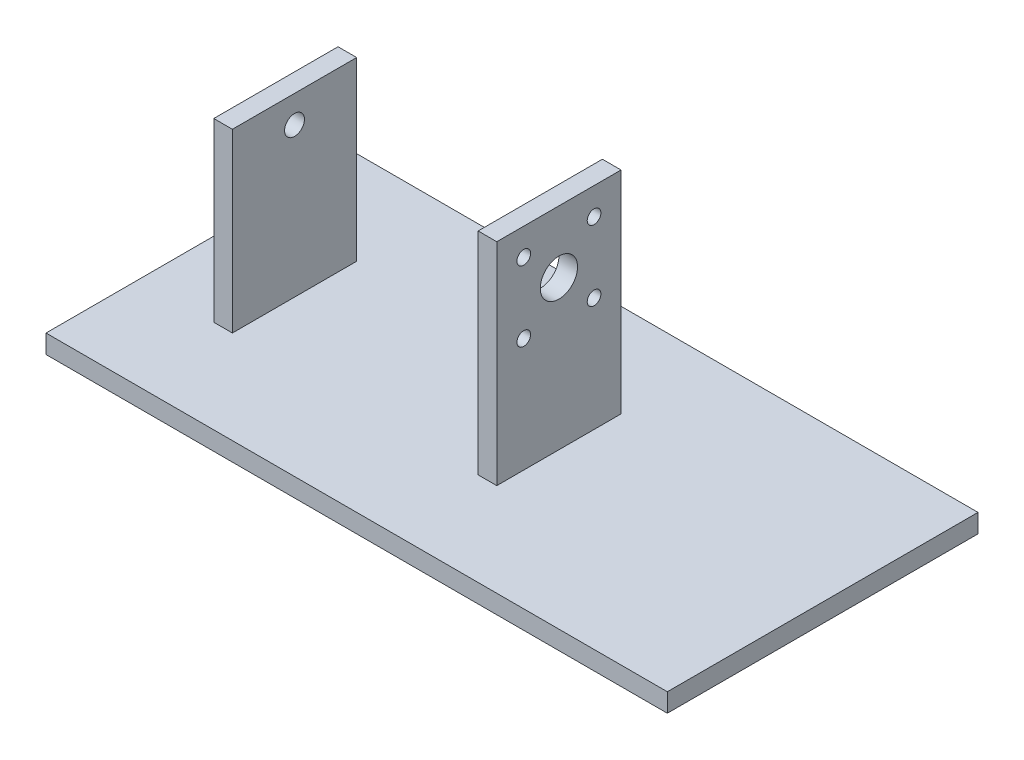
ISO-10303-21;
HEADER;
FILE_DESCRIPTION(('STEP AP214'),'2;1');
FILE_NAME('part.step','',(''),(''),'','','');
FILE_SCHEMA(('AUTOMOTIVE_DESIGN { 1 0 10303 214 1 1 1 1 }'));
ENDSEC;
DATA;
#1=APPLICATION_CONTEXT('core data for automotive mechanical design processes');
#2=APPLICATION_PROTOCOL_DEFINITION('international standard','automotive_design',2000,#1);
#3=PRODUCT_CONTEXT('',#1,'mechanical');
#4=PRODUCT('Part','Part','',(#3));
#5=PRODUCT_RELATED_PRODUCT_CATEGORY('part','',(#4));
#6=PRODUCT_DEFINITION_FORMATION('','',#4);
#7=PRODUCT_DEFINITION_CONTEXT('part definition',#1,'design');
#8=PRODUCT_DEFINITION('design','',#6,#7);
#9=PRODUCT_DEFINITION_SHAPE('','',#8);
#10=(LENGTH_UNIT() NAMED_UNIT(*) SI_UNIT(.MILLI.,.METRE.));
#11=(NAMED_UNIT(*) PLANE_ANGLE_UNIT() SI_UNIT($,.RADIAN.));
#12=(NAMED_UNIT(*) SI_UNIT($,.STERADIAN.) SOLID_ANGLE_UNIT());
#13=UNCERTAINTY_MEASURE_WITH_UNIT(LENGTH_MEASURE(1.E-05),#10,'distance_accuracy_value','');
#14=(GEOMETRIC_REPRESENTATION_CONTEXT(3) GLOBAL_UNCERTAINTY_ASSIGNED_CONTEXT((#13)) GLOBAL_UNIT_ASSIGNED_CONTEXT((#10,
#11,#12)) REPRESENTATION_CONTEXT('',''));
#15=CARTESIAN_POINT('',(0.,0.,0.));
#16=DIRECTION('',(0.,0.,1.));
#17=DIRECTION('',(1.,0.,0.));
#18=AXIS2_PLACEMENT_3D('',#15,#16,#17);
#19=CARTESIAN_POINT('',(0.,3.,-25.));
#20=DIRECTION('',(0.,0.,1.));
#21=DIRECTION('',(1.,0.,0.));
#22=AXIS2_PLACEMENT_3D('',#19,#20,#21);
#23=PLANE('',#22);
#24=DIRECTION('',(-1.,0.,0.));
#25=VECTOR('',#24,1.);
#26=CARTESIAN_POINT('',(0.,0.,-25.));
#27=LINE('',#26,#25);
#28=CARTESIAN_POINT('',(50.,0.,-25.));
#29=VERTEX_POINT('',#28);
#30=CARTESIAN_POINT('',(-50.,0.,-25.));
#31=VERTEX_POINT('',#30);
#32=EDGE_CURVE('E129',#29,#31,#27,.T.);
#33=ORIENTED_EDGE('',*,*,#32,.T.);
#34=DIRECTION('',(0.,-1.,0.));
#35=VECTOR('',#34,1.);
#36=CARTESIAN_POINT('',(-50.,3.,-25.));
#37=LINE('',#36,#35);
#38=CARTESIAN_POINT('',(-50.,3.,-25.));
#39=VERTEX_POINT('',#38);
#40=EDGE_CURVE('E11',#39,#31,#37,.T.);
#41=ORIENTED_EDGE('',*,*,#40,.F.);
#42=DIRECTION('',(-1.,0.,0.));
#43=VECTOR('',#42,1.);
#44=CARTESIAN_POINT('',(0.,3.,-25.));
#45=LINE('',#44,#43);
#46=CARTESIAN_POINT('',(50.,3.,-25.));
#47=VERTEX_POINT('',#46);
#48=EDGE_CURVE('E138',#47,#39,#45,.T.);
#49=ORIENTED_EDGE('',*,*,#48,.F.);
#50=DIRECTION('',(0.,-1.,0.));
#51=VECTOR('',#50,1.);
#52=CARTESIAN_POINT('',(50.,3.,-25.));
#53=LINE('',#52,#51);
#54=EDGE_CURVE('E81',#47,#29,#53,.T.);
#55=ORIENTED_EDGE('',*,*,#54,.T.);
#56=EDGE_LOOP('',(#33,#41,#49,#55));
#57=FACE_BOUND('',#56,.T.);
#58=ADVANCED_FACE('F39',(#57),#23,.F.);
#59=CARTESIAN_POINT('',(-50.,3.,0.));
#60=DIRECTION('',(1.,0.,0.));
#61=DIRECTION('',(0.,0.,-1.));
#62=AXIS2_PLACEMENT_3D('',#59,#60,#61);
#63=PLANE('',#62);
#64=DIRECTION('',(0.,0.,1.));
#65=VECTOR('',#64,1.);
#66=CARTESIAN_POINT('',(-50.,0.,0.));
#67=LINE('',#66,#65);
#68=CARTESIAN_POINT('',(-50.,0.,25.));
#69=VERTEX_POINT('',#68);
#70=EDGE_CURVE('E132',#31,#69,#67,.T.);
#71=ORIENTED_EDGE('',*,*,#70,.T.);
#72=DIRECTION('',(0.,-1.,0.));
#73=VECTOR('',#72,1.);
#74=CARTESIAN_POINT('',(-50.,3.,25.));
#75=LINE('',#74,#73);
#76=CARTESIAN_POINT('',(-50.,3.,25.));
#77=VERTEX_POINT('',#76);
#78=EDGE_CURVE('E47',#77,#69,#75,.T.);
#79=ORIENTED_EDGE('',*,*,#78,.F.);
#80=DIRECTION('',(0.,0.,1.));
#81=VECTOR('',#80,1.);
#82=CARTESIAN_POINT('',(-50.,3.,0.));
#83=LINE('',#82,#81);
#84=EDGE_CURVE('E89',#39,#77,#83,.T.);
#85=ORIENTED_EDGE('',*,*,#84,.F.);
#86=ORIENTED_EDGE('',*,*,#40,.T.);
#87=EDGE_LOOP('',(#71,#79,#85,#86));
#88=FACE_BOUND('',#87,.T.);
#89=ADVANCED_FACE('F171',(#88),#63,.F.);
#90=CARTESIAN_POINT('',(0.,3.,25.));
#91=DIRECTION('',(0.,0.,1.));
#92=DIRECTION('',(1.,0.,0.));
#93=AXIS2_PLACEMENT_3D('',#90,#91,#92);
#94=PLANE('',#93);
#95=DIRECTION('',(-1.,0.,0.));
#96=VECTOR('',#95,1.);
#97=CARTESIAN_POINT('',(0.,0.,25.));
#98=LINE('',#97,#96);
#99=CARTESIAN_POINT('',(50.,0.,25.));
#100=VERTEX_POINT('',#99);
#101=EDGE_CURVE('E162',#100,#69,#98,.T.);
#102=ORIENTED_EDGE('',*,*,#101,.F.);
#103=DIRECTION('',(0.,-1.,0.));
#104=VECTOR('',#103,1.);
#105=CARTESIAN_POINT('',(50.,3.,25.));
#106=LINE('',#105,#104);
#107=CARTESIAN_POINT('',(50.,3.,25.));
#108=VERTEX_POINT('',#107);
#109=EDGE_CURVE('E73',#108,#100,#106,.T.);
#110=ORIENTED_EDGE('',*,*,#109,.F.);
#111=DIRECTION('',(-1.,0.,0.));
#112=VECTOR('',#111,1.);
#113=CARTESIAN_POINT('',(0.,3.,25.));
#114=LINE('',#113,#112);
#115=EDGE_CURVE('E142',#108,#77,#114,.T.);
#116=ORIENTED_EDGE('',*,*,#115,.T.);
#117=ORIENTED_EDGE('',*,*,#78,.T.);
#118=EDGE_LOOP('',(#102,#110,#116,#117));
#119=FACE_BOUND('',#118,.T.);
#120=ADVANCED_FACE('F169',(#119),#94,.T.);
#121=CARTESIAN_POINT('',(50.,3.,0.));
#122=DIRECTION('',(1.,0.,0.));
#123=DIRECTION('',(0.,0.,-1.));
#124=AXIS2_PLACEMENT_3D('',#121,#122,#123);
#125=PLANE('',#124);
#126=DIRECTION('',(0.,0.,1.));
#127=VECTOR('',#126,1.);
#128=CARTESIAN_POINT('',(50.,0.,0.));
#129=LINE('',#128,#127);
#130=EDGE_CURVE('E140',#29,#100,#129,.T.);
#131=ORIENTED_EDGE('',*,*,#130,.F.);
#132=ORIENTED_EDGE('',*,*,#54,.F.);
#133=DIRECTION('',(0.,0.,1.));
#134=VECTOR('',#133,1.);
#135=CARTESIAN_POINT('',(50.,3.,0.));
#136=LINE('',#135,#134);
#137=EDGE_CURVE('E145',#47,#108,#136,.T.);
#138=ORIENTED_EDGE('',*,*,#137,.T.);
#139=ORIENTED_EDGE('',*,*,#109,.T.);
#140=EDGE_LOOP('',(#131,#132,#138,#139));
#141=FACE_BOUND('',#140,.T.);
#142=ADVANCED_FACE('F175',(#141),#125,.T.);
#143=CARTESIAN_POINT('',(0.,3.,0.));
#144=DIRECTION('',(0.,1.,0.));
#145=DIRECTION('',(0.,0.,1.));
#146=AXIS2_PLACEMENT_3D('',#143,#144,#145);
#147=PLANE('',#146);
#148=ORIENTED_EDGE('',*,*,#48,.T.);
#149=ORIENTED_EDGE('',*,*,#84,.T.);
#150=ORIENTED_EDGE('',*,*,#115,.F.);
#151=ORIENTED_EDGE('',*,*,#137,.F.);
#152=EDGE_LOOP('',(#148,#149,#150,#151));
#153=FACE_BOUND('',#152,.T.);
#154=DIRECTION('',(1.,0.,0.));
#155=VECTOR('',#154,1.);
#156=CARTESIAN_POINT('',(0.,3.,-10.));
#157=LINE('',#156,#155);
#158=CARTESIAN_POINT('',(-38.,3.,-10.));
#159=VERTEX_POINT('',#158);
#160=CARTESIAN_POINT('',(-35.,3.,-10.));
#161=VERTEX_POINT('',#160);
#162=EDGE_CURVE('E147',#159,#161,#157,.T.);
#163=ORIENTED_EDGE('',*,*,#162,.T.);
#164=DIRECTION('',(0.,0.,1.));
#165=VECTOR('',#164,1.);
#166=CARTESIAN_POINT('',(-35.,3.,0.));
#167=LINE('',#166,#165);
#168=CARTESIAN_POINT('',(-35.,3.,10.));
#169=VERTEX_POINT('',#168);
#170=EDGE_CURVE('E150',#161,#169,#167,.T.);
#171=ORIENTED_EDGE('',*,*,#170,.T.);
#172=DIRECTION('',(1.,0.,0.));
#173=VECTOR('',#172,1.);
#174=CARTESIAN_POINT('',(0.,3.,10.));
#175=LINE('',#174,#173);
#176=CARTESIAN_POINT('',(-38.,3.,10.));
#177=VERTEX_POINT('',#176);
#178=EDGE_CURVE('E153',#177,#169,#175,.T.);
#179=ORIENTED_EDGE('',*,*,#178,.F.);
#180=DIRECTION('',(0.,0.,1.));
#181=VECTOR('',#180,1.);
#182=CARTESIAN_POINT('',(-38.,3.,0.));
#183=LINE('',#182,#181);
#184=EDGE_CURVE('E111',#159,#177,#183,.T.);
#185=ORIENTED_EDGE('',*,*,#184,.F.);
#186=EDGE_LOOP('',(#163,#171,#179,#185));
#187=FACE_BOUND('',#186,.T.);
#188=DIRECTION('',(1.,0.,0.));
#189=VECTOR('',#188,1.);
#190=CARTESIAN_POINT('',(0.,3.,-10.));
#191=LINE('',#190,#189);
#192=CARTESIAN_POINT('',(4.54999999999998,3.,-10.));
#193=VERTEX_POINT('',#192);
#194=CARTESIAN_POINT('',(7.54999999999998,3.,-10.));
#195=VERTEX_POINT('',#194);
#196=EDGE_CURVE('E102',#193,#195,#191,.T.);
#197=ORIENTED_EDGE('',*,*,#196,.T.);
#198=DIRECTION('',(0.,0.,1.));
#199=VECTOR('',#198,1.);
#200=CARTESIAN_POINT('',(7.54999999999998,3.,0.));
#201=LINE('',#200,#199);
#202=CARTESIAN_POINT('',(7.54999999999998,3.,10.));
#203=VERTEX_POINT('',#202);
#204=EDGE_CURVE('E105',#195,#203,#201,.T.);
#205=ORIENTED_EDGE('',*,*,#204,.T.);
#206=DIRECTION('',(1.,0.,0.));
#207=VECTOR('',#206,1.);
#208=CARTESIAN_POINT('',(0.,3.,10.));
#209=LINE('',#208,#207);
#210=CARTESIAN_POINT('',(4.54999999999998,3.,10.));
#211=VERTEX_POINT('',#210);
#212=EDGE_CURVE('E123',#211,#203,#209,.T.);
#213=ORIENTED_EDGE('',*,*,#212,.F.);
#214=DIRECTION('',(0.,0.,1.));
#215=VECTOR('',#214,1.);
#216=CARTESIAN_POINT('',(4.54999999999998,3.,0.));
#217=LINE('',#216,#215);
#218=EDGE_CURVE('E55',#193,#211,#217,.T.);
#219=ORIENTED_EDGE('',*,*,#218,.F.);
#220=EDGE_LOOP('',(#197,#205,#213,#219));
#221=FACE_BOUND('',#220,.T.);
#222=ADVANCED_FACE('F104',(#153,#187,#221),#147,.T.);
#223=CARTESIAN_POINT('',(0.,0.,0.));
#224=DIRECTION('',(0.,1.,0.));
#225=DIRECTION('',(0.,0.,1.));
#226=AXIS2_PLACEMENT_3D('',#223,#224,#225);
#227=PLANE('',#226);
#228=ORIENTED_EDGE('',*,*,#32,.F.);
#229=ORIENTED_EDGE('',*,*,#130,.T.);
#230=ORIENTED_EDGE('',*,*,#101,.T.);
#231=ORIENTED_EDGE('',*,*,#70,.F.);
#232=EDGE_LOOP('',(#228,#229,#230,#231));
#233=FACE_BOUND('',#232,.T.);
#234=ADVANCED_FACE('F174',(#233),#227,.F.);
#235=CARTESIAN_POINT('',(7.54999999999998,37.,0.));
#236=DIRECTION('',(1.,0.,0.));
#237=DIRECTION('',(0.,0.,-1.));
#238=AXIS2_PLACEMENT_3D('',#235,#236,#237);
#239=PLANE('',#238);
#240=CARTESIAN_POINT('',(7.54999999999998,21.3431457505077,-5.65685424949242));
#241=DIRECTION('',(1.,0.,0.));
#242=DIRECTION('',(0.,-1.,0.));
#243=AXIS2_PLACEMENT_3D('',#240,#241,#242);
#244=CIRCLE('',#243,1.1);
#245=CARTESIAN_POINT('',(7.54999999999998,20.2431457505077,-5.65685424949243));
#246=VERTEX_POINT('',#245);
#247=EDGE_CURVE('E420',#246,#246,#244,.T.);
#248=ORIENTED_EDGE('',*,*,#247,.F.);
#249=EDGE_LOOP('',(#248));
#250=FACE_BOUND('',#249,.T.);
#251=CARTESIAN_POINT('',(7.54999999999998,32.6568542494924,5.65685424949237));
#252=DIRECTION('',(1.,0.,0.));
#253=DIRECTION('',(0.,1.,0.));
#254=AXIS2_PLACEMENT_3D('',#251,#252,#253);
#255=CIRCLE('',#254,1.1);
#256=CARTESIAN_POINT('',(7.54999999999998,33.7568542494924,5.65685424949237));
#257=VERTEX_POINT('',#256);
#258=EDGE_CURVE('E411',#257,#257,#255,.T.);
#259=ORIENTED_EDGE('',*,*,#258,.F.);
#260=EDGE_LOOP('',(#259));
#261=FACE_BOUND('',#260,.T.);
#262=CARTESIAN_POINT('',(7.54999999999998,21.3431457505076,5.6568542494924));
#263=DIRECTION('',(1.,0.,0.));
#264=DIRECTION('',(0.,0.,1.));
#265=AXIS2_PLACEMENT_3D('',#262,#263,#264);
#266=CIRCLE('',#265,1.1);
#267=CARTESIAN_POINT('',(7.54999999999998,21.3431457505076,6.7568542494924));
#268=VERTEX_POINT('',#267);
#269=EDGE_CURVE('E419',#268,#268,#266,.T.);
#270=ORIENTED_EDGE('',*,*,#269,.F.);
#271=EDGE_LOOP('',(#270));
#272=FACE_BOUND('',#271,.T.);
#273=CARTESIAN_POINT('',(7.54999999999998,27.,0.));
#274=DIRECTION('',(1.,0.,0.));
#275=DIRECTION('',(0.,0.,-1.));
#276=AXIS2_PLACEMENT_3D('',#273,#274,#275);
#277=CIRCLE('',#276,3.);
#278=CARTESIAN_POINT('',(7.54999999999998,27.,-3.));
#279=VERTEX_POINT('',#278);
#280=EDGE_CURVE('E265',#279,#279,#277,.T.);
#281=ORIENTED_EDGE('',*,*,#280,.F.);
#282=EDGE_LOOP('',(#281));
#283=FACE_BOUND('',#282,.T.);
#284=CARTESIAN_POINT('',(7.54999999999998,32.6568542494923,-5.65685424949241));
#285=DIRECTION('',(1.,0.,0.));
#286=DIRECTION('',(0.,0.,-1.));
#287=AXIS2_PLACEMENT_3D('',#284,#285,#286);
#288=CIRCLE('',#287,1.1);
#289=CARTESIAN_POINT('',(7.54999999999998,32.6568542494923,-6.7568542494924));
#290=VERTEX_POINT('',#289);
#291=EDGE_CURVE('E407',#290,#290,#288,.T.);
#292=ORIENTED_EDGE('',*,*,#291,.F.);
#293=EDGE_LOOP('',(#292));
#294=FACE_BOUND('',#293,.T.);
#295=DIRECTION('',(0.,-1.,0.));
#296=VECTOR('',#295,1.);
#297=CARTESIAN_POINT('',(7.54999999999998,37.,10.));
#298=LINE('',#297,#296);
#299=CARTESIAN_POINT('',(7.54999999999998,37.,10.));
#300=VERTEX_POINT('',#299);
#301=EDGE_CURVE('E122',#300,#203,#298,.T.);
#302=ORIENTED_EDGE('',*,*,#301,.T.);
#303=ORIENTED_EDGE('',*,*,#204,.F.);
#304=DIRECTION('',(0.,-1.,0.));
#305=VECTOR('',#304,1.);
#306=CARTESIAN_POINT('',(7.54999999999998,37.,-10.));
#307=LINE('',#306,#305);
#308=CARTESIAN_POINT('',(7.54999999999998,37.,-10.));
#309=VERTEX_POINT('',#308);
#310=EDGE_CURVE('E119',#309,#195,#307,.T.);
#311=ORIENTED_EDGE('',*,*,#310,.F.);
#312=DIRECTION('',(0.,0.,1.));
#313=VECTOR('',#312,1.);
#314=CARTESIAN_POINT('',(7.54999999999998,37.,0.));
#315=LINE('',#314,#313);
#316=EDGE_CURVE('E208',#309,#300,#315,.T.);
#317=ORIENTED_EDGE('',*,*,#316,.T.);
#318=EDGE_LOOP('',(#302,#303,#311,#317));
#319=FACE_BOUND('',#318,.T.);
#320=ADVANCED_FACE('F116',(#250,#261,#272,#283,#294,#319),#239,.T.);
#321=CARTESIAN_POINT('',(0.,37.,-10.));
#322=DIRECTION('',(0.,0.,-1.));
#323=DIRECTION('',(-1.,0.,0.));
#324=AXIS2_PLACEMENT_3D('',#321,#322,#323);
#325=PLANE('',#324);
#326=ORIENTED_EDGE('',*,*,#310,.T.);
#327=ORIENTED_EDGE('',*,*,#196,.F.);
#328=DIRECTION('',(0.,-1.,0.));
#329=VECTOR('',#328,1.);
#330=CARTESIAN_POINT('',(4.54999999999998,37.,-10.));
#331=LINE('',#330,#329);
#332=CARTESIAN_POINT('',(4.54999999999998,37.,-10.));
#333=VERTEX_POINT('',#332);
#334=EDGE_CURVE('E130',#333,#193,#331,.T.);
#335=ORIENTED_EDGE('',*,*,#334,.F.);
#336=DIRECTION('',(1.,0.,0.));
#337=VECTOR('',#336,1.);
#338=CARTESIAN_POINT('',(0.,37.,-10.));
#339=LINE('',#338,#337);
#340=EDGE_CURVE('E128',#333,#309,#339,.T.);
#341=ORIENTED_EDGE('',*,*,#340,.T.);
#342=EDGE_LOOP('',(#326,#327,#335,#341));
#343=FACE_BOUND('',#342,.T.);
#344=ADVANCED_FACE('F126',(#343),#325,.T.);
#345=CARTESIAN_POINT('',(4.54999999999998,37.,0.));
#346=DIRECTION('',(1.,0.,0.));
#347=DIRECTION('',(0.,0.,-1.));
#348=AXIS2_PLACEMENT_3D('',#345,#346,#347);
#349=PLANE('',#348);
#350=CARTESIAN_POINT('',(4.54999999999998,21.3431457505077,-5.65685424949242));
#351=DIRECTION('',(1.,0.,0.));
#352=DIRECTION('',(0.,0.,-1.));
#353=AXIS2_PLACEMENT_3D('',#350,#351,#352);
#354=CIRCLE('',#353,1.1);
#355=CARTESIAN_POINT('',(4.54999999999998,21.3431457505077,-6.75685424949241));
#356=VERTEX_POINT('',#355);
#357=EDGE_CURVE('E416',#356,#356,#354,.F.);
#358=ORIENTED_EDGE('',*,*,#357,.F.);
#359=EDGE_LOOP('',(#358));
#360=FACE_BOUND('',#359,.T.);
#361=CARTESIAN_POINT('',(4.54999999999998,32.6568542494924,5.65685424949237));
#362=DIRECTION('',(1.,0.,0.));
#363=DIRECTION('',(0.,0.,-1.));
#364=AXIS2_PLACEMENT_3D('',#361,#362,#363);
#365=CIRCLE('',#364,1.1);
#366=CARTESIAN_POINT('',(4.54999999999998,32.6568542494924,4.55685424949237));
#367=VERTEX_POINT('',#366);
#368=EDGE_CURVE('E409',#367,#367,#365,.F.);
#369=ORIENTED_EDGE('',*,*,#368,.F.);
#370=EDGE_LOOP('',(#369));
#371=FACE_BOUND('',#370,.T.);
#372=CARTESIAN_POINT('',(4.54999999999998,21.3431457505076,5.6568542494924));
#373=DIRECTION('',(1.,0.,0.));
#374=DIRECTION('',(0.,0.,-1.));
#375=AXIS2_PLACEMENT_3D('',#372,#373,#374);
#376=CIRCLE('',#375,1.1);
#377=CARTESIAN_POINT('',(4.54999999999998,21.3431457505076,4.55685424949241));
#378=VERTEX_POINT('',#377);
#379=EDGE_CURVE('E426',#378,#378,#376,.F.);
#380=ORIENTED_EDGE('',*,*,#379,.F.);
#381=EDGE_LOOP('',(#380));
#382=FACE_BOUND('',#381,.T.);
#383=CARTESIAN_POINT('',(4.54999999999998,27.,0.));
#384=DIRECTION('',(1.,0.,0.));
#385=DIRECTION('',(0.,0.,-1.));
#386=AXIS2_PLACEMENT_3D('',#383,#384,#385);
#387=CIRCLE('',#386,3.);
#388=CARTESIAN_POINT('',(4.54999999999998,27.,-3.));
#389=VERTEX_POINT('',#388);
#390=EDGE_CURVE('E262',#389,#389,#387,.F.);
#391=ORIENTED_EDGE('',*,*,#390,.F.);
#392=EDGE_LOOP('',(#391));
#393=FACE_BOUND('',#392,.T.);
#394=CARTESIAN_POINT('',(4.54999999999998,32.6568542494923,-5.65685424949241));
#395=DIRECTION('',(1.,0.,0.));
#396=DIRECTION('',(0.,0.,-1.));
#397=AXIS2_PLACEMENT_3D('',#394,#395,#396);
#398=CIRCLE('',#397,1.1);
#399=CARTESIAN_POINT('',(4.54999999999998,32.6568542494923,-6.7568542494924));
#400=VERTEX_POINT('',#399);
#401=EDGE_CURVE('E268',#400,#400,#398,.F.);
#402=ORIENTED_EDGE('',*,*,#401,.F.);
#403=EDGE_LOOP('',(#402));
#404=FACE_BOUND('',#403,.T.);
#405=ORIENTED_EDGE('',*,*,#218,.T.);
#406=DIRECTION('',(0.,-1.,0.));
#407=VECTOR('',#406,1.);
#408=CARTESIAN_POINT('',(4.54999999999998,37.,10.));
#409=LINE('',#408,#407);
#410=CARTESIAN_POINT('',(4.54999999999998,37.,10.));
#411=VERTEX_POINT('',#410);
#412=EDGE_CURVE('E134',#411,#211,#409,.T.);
#413=ORIENTED_EDGE('',*,*,#412,.F.);
#414=DIRECTION('',(0.,0.,1.));
#415=VECTOR('',#414,1.);
#416=CARTESIAN_POINT('',(4.54999999999998,37.,0.));
#417=LINE('',#416,#415);
#418=EDGE_CURVE('E220',#333,#411,#417,.T.);
#419=ORIENTED_EDGE('',*,*,#418,.F.);
#420=ORIENTED_EDGE('',*,*,#334,.T.);
#421=EDGE_LOOP('',(#405,#413,#419,#420));
#422=FACE_BOUND('',#421,.T.);
#423=ADVANCED_FACE('F234',(#360,#371,#382,#393,#404,#422),#349,.F.);
#424=CARTESIAN_POINT('',(0.,37.,10.));
#425=DIRECTION('',(0.,0.,-1.));
#426=DIRECTION('',(-1.,0.,0.));
#427=AXIS2_PLACEMENT_3D('',#424,#425,#426);
#428=PLANE('',#427);
#429=ORIENTED_EDGE('',*,*,#212,.T.);
#430=ORIENTED_EDGE('',*,*,#301,.F.);
#431=DIRECTION('',(1.,0.,0.));
#432=VECTOR('',#431,1.);
#433=CARTESIAN_POINT('',(0.,37.,10.));
#434=LINE('',#433,#432);
#435=EDGE_CURVE('E223',#411,#300,#434,.T.);
#436=ORIENTED_EDGE('',*,*,#435,.F.);
#437=ORIENTED_EDGE('',*,*,#412,.T.);
#438=EDGE_LOOP('',(#429,#430,#436,#437));
#439=FACE_BOUND('',#438,.T.);
#440=ADVANCED_FACE('F230',(#439),#428,.F.);
#441=CARTESIAN_POINT('',(0.,37.,0.));
#442=DIRECTION('',(0.,1.,0.));
#443=DIRECTION('',(0.,0.,1.));
#444=AXIS2_PLACEMENT_3D('',#441,#442,#443);
#445=PLANE('',#444);
#446=ORIENTED_EDGE('',*,*,#316,.F.);
#447=ORIENTED_EDGE('',*,*,#340,.F.);
#448=ORIENTED_EDGE('',*,*,#418,.T.);
#449=ORIENTED_EDGE('',*,*,#435,.T.);
#450=EDGE_LOOP('',(#446,#447,#448,#449));
#451=FACE_BOUND('',#450,.T.);
#452=ADVANCED_FACE('F305',(#451),#445,.T.);
#453=CARTESIAN_POINT('',(-38.,31.4,-10.));
#454=DIRECTION('',(0.,0.,-1.));
#455=DIRECTION('',(-1.,0.,0.));
#456=AXIS2_PLACEMENT_3D('',#453,#454,#455);
#457=PLANE('',#456);
#458=DIRECTION('',(0.,-1.,0.));
#459=VECTOR('',#458,1.);
#460=CARTESIAN_POINT('',(-35.,31.4,-10.));
#461=LINE('',#460,#459);
#462=CARTESIAN_POINT('',(-35.,31.4,-10.));
#463=VERTEX_POINT('',#462);
#464=EDGE_CURVE('E199',#463,#161,#461,.T.);
#465=ORIENTED_EDGE('',*,*,#464,.T.);
#466=ORIENTED_EDGE('',*,*,#162,.F.);
#467=DIRECTION('',(0.,-1.,0.));
#468=VECTOR('',#467,1.);
#469=CARTESIAN_POINT('',(-38.,31.4,-10.));
#470=LINE('',#469,#468);
#471=CARTESIAN_POINT('',(-38.,31.4,-10.));
#472=VERTEX_POINT('',#471);
#473=EDGE_CURVE('E196',#472,#159,#470,.T.);
#474=ORIENTED_EDGE('',*,*,#473,.F.);
#475=DIRECTION('',(1.,0.,0.));
#476=VECTOR('',#475,1.);
#477=CARTESIAN_POINT('',(-38.,31.4,-10.));
#478=LINE('',#477,#476);
#479=EDGE_CURVE('E257',#472,#463,#478,.T.);
#480=ORIENTED_EDGE('',*,*,#479,.T.);
#481=EDGE_LOOP('',(#465,#466,#474,#480));
#482=FACE_BOUND('',#481,.T.);
#483=ADVANCED_FACE('F194',(#482),#457,.T.);
#484=CARTESIAN_POINT('',(-38.,31.4,-10.));
#485=DIRECTION('',(1.,0.,0.));
#486=DIRECTION('',(0.,0.,-1.));
#487=AXIS2_PLACEMENT_3D('',#484,#485,#486);
#488=PLANE('',#487);
#489=CARTESIAN_POINT('',(-38.,27.,0.));
#490=DIRECTION('',(1.,0.,0.));
#491=DIRECTION('',(0.,0.,-1.));
#492=AXIS2_PLACEMENT_3D('',#489,#490,#491);
#493=CIRCLE('',#492,1.6);
#494=CARTESIAN_POINT('',(-38.,27.,1.6));
#495=VERTEX_POINT('',#494);
#496=EDGE_CURVE('E422',#495,#495,#493,.T.);
#497=ORIENTED_EDGE('',*,*,#496,.T.);
#498=EDGE_LOOP('',(#497));
#499=FACE_BOUND('',#498,.T.);
#500=ORIENTED_EDGE('',*,*,#184,.T.);
#501=DIRECTION('',(0.,-1.,0.));
#502=VECTOR('',#501,1.);
#503=CARTESIAN_POINT('',(-38.,31.4,10.));
#504=LINE('',#503,#502);
#505=CARTESIAN_POINT('',(-38.,31.4,10.));
#506=VERTEX_POINT('',#505);
#507=EDGE_CURVE('E209',#506,#177,#504,.T.);
#508=ORIENTED_EDGE('',*,*,#507,.F.);
#509=DIRECTION('',(0.,0.,1.));
#510=VECTOR('',#509,1.);
#511=CARTESIAN_POINT('',(-38.,31.4,-10.));
#512=LINE('',#511,#510);
#513=EDGE_CURVE('E206',#472,#506,#512,.T.);
#514=ORIENTED_EDGE('',*,*,#513,.F.);
#515=ORIENTED_EDGE('',*,*,#473,.T.);
#516=EDGE_LOOP('',(#500,#508,#514,#515));
#517=FACE_BOUND('',#516,.T.);
#518=ADVANCED_FACE('F202',(#499,#517),#488,.F.);
#519=CARTESIAN_POINT('',(-38.,31.4,10.));
#520=DIRECTION('',(0.,0.,-1.));
#521=DIRECTION('',(-1.,0.,0.));
#522=AXIS2_PLACEMENT_3D('',#519,#520,#521);
#523=PLANE('',#522);
#524=ORIENTED_EDGE('',*,*,#178,.T.);
#525=DIRECTION('',(0.,-1.,0.));
#526=VECTOR('',#525,1.);
#527=CARTESIAN_POINT('',(-35.,31.4,10.));
#528=LINE('',#527,#526);
#529=CARTESIAN_POINT('',(-35.,31.4,10.));
#530=VERTEX_POINT('',#529);
#531=EDGE_CURVE('E212',#530,#169,#528,.T.);
#532=ORIENTED_EDGE('',*,*,#531,.F.);
#533=DIRECTION('',(1.,0.,0.));
#534=VECTOR('',#533,1.);
#535=CARTESIAN_POINT('',(-38.,31.4,10.));
#536=LINE('',#535,#534);
#537=EDGE_CURVE('E259',#506,#530,#536,.T.);
#538=ORIENTED_EDGE('',*,*,#537,.F.);
#539=ORIENTED_EDGE('',*,*,#507,.T.);
#540=EDGE_LOOP('',(#524,#532,#538,#539));
#541=FACE_BOUND('',#540,.T.);
#542=ADVANCED_FACE('F271',(#541),#523,.F.);
#543=CARTESIAN_POINT('',(-35.,31.4,-10.));
#544=DIRECTION('',(1.,0.,0.));
#545=DIRECTION('',(0.,0.,-1.));
#546=AXIS2_PLACEMENT_3D('',#543,#544,#545);
#547=PLANE('',#546);
#548=CARTESIAN_POINT('',(-35.,27.,0.));
#549=DIRECTION('',(1.,0.,0.));
#550=DIRECTION('',(0.,0.,-1.));
#551=AXIS2_PLACEMENT_3D('',#548,#549,#550);
#552=CIRCLE('',#551,1.6);
#553=CARTESIAN_POINT('',(-35.,27.,1.6));
#554=VERTEX_POINT('',#553);
#555=EDGE_CURVE('E433',#554,#554,#552,.F.);
#556=ORIENTED_EDGE('',*,*,#555,.T.);
#557=EDGE_LOOP('',(#556));
#558=FACE_BOUND('',#557,.T.);
#559=ORIENTED_EDGE('',*,*,#531,.T.);
#560=ORIENTED_EDGE('',*,*,#170,.F.);
#561=ORIENTED_EDGE('',*,*,#464,.F.);
#562=DIRECTION('',(0.,0.,1.));
#563=VECTOR('',#562,1.);
#564=CARTESIAN_POINT('',(-35.,31.4,-10.));
#565=LINE('',#564,#563);
#566=EDGE_CURVE('E254',#463,#530,#565,.T.);
#567=ORIENTED_EDGE('',*,*,#566,.T.);
#568=EDGE_LOOP('',(#559,#560,#561,#567));
#569=FACE_BOUND('',#568,.T.);
#570=ADVANCED_FACE('F253',(#558,#569),#547,.T.);
#571=CARTESIAN_POINT('',(0.,31.4,0.));
#572=DIRECTION('',(0.,-1.,0.));
#573=DIRECTION('',(0.,0.,-1.));
#574=AXIS2_PLACEMENT_3D('',#571,#572,#573);
#575=PLANE('',#574);
#576=ORIENTED_EDGE('',*,*,#479,.F.);
#577=ORIENTED_EDGE('',*,*,#513,.T.);
#578=ORIENTED_EDGE('',*,*,#537,.T.);
#579=ORIENTED_EDGE('',*,*,#566,.F.);
#580=EDGE_LOOP('',(#576,#577,#578,#579));
#581=FACE_BOUND('',#580,.T.);
#582=ADVANCED_FACE('F256',(#581),#575,.F.);
#583=CARTESIAN_POINT('',(-3.93528137423859,32.6568542494923,-5.65685424949241));
#584=DIRECTION('',(1.,0.,0.));
#585=DIRECTION('',(0.,0.,-1.));
#586=AXIS2_PLACEMENT_3D('',#583,#584,#585);
#587=CYLINDRICAL_SURFACE('',#586,1.1);
#588=ORIENTED_EDGE('',*,*,#401,.T.);
#589=EDGE_LOOP('',(#588));
#590=FACE_BOUND('',#589,.T.);
#591=ORIENTED_EDGE('',*,*,#291,.T.);
#592=EDGE_LOOP('',(#591));
#593=FACE_BOUND('',#592,.T.);
#594=ADVANCED_FACE('F371',(#590,#593),#587,.F.);
#595=CARTESIAN_POINT('',(-3.93528137423859,27.,0.));
#596=DIRECTION('',(1.,0.,0.));
#597=DIRECTION('',(0.,0.,-1.));
#598=AXIS2_PLACEMENT_3D('',#595,#596,#597);
#599=CYLINDRICAL_SURFACE('',#598,3.);
#600=ORIENTED_EDGE('',*,*,#390,.T.);
#601=EDGE_LOOP('',(#600));
#602=FACE_BOUND('',#601,.T.);
#603=ORIENTED_EDGE('',*,*,#280,.T.);
#604=EDGE_LOOP('',(#603));
#605=FACE_BOUND('',#604,.T.);
#606=ADVANCED_FACE('F362',(#602,#605),#599,.F.);
#607=CARTESIAN_POINT('',(-3.93528137423859,21.3431457505076,5.6568542494924));
#608=DIRECTION('',(1.,0.,0.));
#609=DIRECTION('',(0.,0.,-1.));
#610=AXIS2_PLACEMENT_3D('',#607,#608,#609);
#611=CYLINDRICAL_SURFACE('',#610,1.1);
#612=ORIENTED_EDGE('',*,*,#379,.T.);
#613=EDGE_LOOP('',(#612));
#614=FACE_BOUND('',#613,.T.);
#615=ORIENTED_EDGE('',*,*,#269,.T.);
#616=EDGE_LOOP('',(#615));
#617=FACE_BOUND('',#616,.T.);
#618=ADVANCED_FACE('F354',(#614,#617),#611,.F.);
#619=CARTESIAN_POINT('',(-3.93528137423859,32.6568542494924,5.65685424949237));
#620=DIRECTION('',(1.,0.,0.));
#621=DIRECTION('',(0.,0.,-1.));
#622=AXIS2_PLACEMENT_3D('',#619,#620,#621);
#623=CYLINDRICAL_SURFACE('',#622,1.1);
#624=ORIENTED_EDGE('',*,*,#368,.T.);
#625=EDGE_LOOP('',(#624));
#626=FACE_BOUND('',#625,.T.);
#627=ORIENTED_EDGE('',*,*,#258,.T.);
#628=EDGE_LOOP('',(#627));
#629=FACE_BOUND('',#628,.T.);
#630=ADVANCED_FACE('F349',(#626,#629),#623,.F.);
#631=CARTESIAN_POINT('',(-3.93528137423859,21.3431457505077,-5.65685424949242));
#632=DIRECTION('',(1.,0.,0.));
#633=DIRECTION('',(0.,0.,-1.));
#634=AXIS2_PLACEMENT_3D('',#631,#632,#633);
#635=CYLINDRICAL_SURFACE('',#634,1.1);
#636=ORIENTED_EDGE('',*,*,#357,.T.);
#637=EDGE_LOOP('',(#636));
#638=FACE_BOUND('',#637,.T.);
#639=ORIENTED_EDGE('',*,*,#247,.T.);
#640=EDGE_LOOP('',(#639));
#641=FACE_BOUND('',#640,.T.);
#642=ADVANCED_FACE('F325',(#638,#641),#635,.F.);
#643=CARTESIAN_POINT('',(-30.4745166004061,27.,0.));
#644=DIRECTION('',(-1.,0.,0.));
#645=DIRECTION('',(0.,0.,1.));
#646=AXIS2_PLACEMENT_3D('',#643,#644,#645);
#647=CYLINDRICAL_SURFACE('',#646,1.6);
#648=CARTESIAN_POINT('',(-35.,27.,1.6));
#649=CARTESIAN_POINT('',(-35.03125,27.,1.6));
#650=CARTESIAN_POINT('',(-35.0625,27.,1.6));
#651=CARTESIAN_POINT('',(-35.125,27.,1.6));
#652=CARTESIAN_POINT('',(-35.15625,27.,1.6));
#653=CARTESIAN_POINT('',(-35.21875,27.,1.6));
#654=CARTESIAN_POINT('',(-35.25,27.,1.6));
#655=CARTESIAN_POINT('',(-35.3125,27.,1.6));
#656=CARTESIAN_POINT('',(-35.34375,27.,1.6));
#657=CARTESIAN_POINT('',(-35.40625,27.,1.6));
#658=CARTESIAN_POINT('',(-35.4375,27.,1.6));
#659=CARTESIAN_POINT('',(-35.5,27.,1.6));
#660=CARTESIAN_POINT('',(-35.53125,27.,1.6));
#661=CARTESIAN_POINT('',(-35.59375,27.,1.6));
#662=CARTESIAN_POINT('',(-35.625,27.,1.6));
#663=CARTESIAN_POINT('',(-35.6875,27.,1.6));
#664=CARTESIAN_POINT('',(-35.71875,27.,1.6));
#665=CARTESIAN_POINT('',(-35.78125,27.,1.6));
#666=CARTESIAN_POINT('',(-35.8125,27.,1.6));
#667=CARTESIAN_POINT('',(-35.875,27.,1.6));
#668=CARTESIAN_POINT('',(-35.90625,27.,1.6));
#669=CARTESIAN_POINT('',(-35.96875,27.,1.6));
#670=CARTESIAN_POINT('',(-36.,27.,1.6));
#671=CARTESIAN_POINT('',(-36.0625,27.,1.6));
#672=CARTESIAN_POINT('',(-36.09375,27.,1.6));
#673=CARTESIAN_POINT('',(-36.15625,27.,1.6));
#674=CARTESIAN_POINT('',(-36.1875,27.,1.6));
#675=CARTESIAN_POINT('',(-36.25,27.,1.6));
#676=CARTESIAN_POINT('',(-36.28125,27.,1.6));
#677=CARTESIAN_POINT('',(-36.34375,27.,1.6));
#678=CARTESIAN_POINT('',(-36.375,27.,1.6));
#679=CARTESIAN_POINT('',(-36.4375,27.,1.6));
#680=CARTESIAN_POINT('',(-36.46875,27.,1.6));
#681=CARTESIAN_POINT('',(-36.53125,27.,1.6));
#682=CARTESIAN_POINT('',(-36.5625,27.,1.6));
#683=CARTESIAN_POINT('',(-36.625,27.,1.6));
#684=CARTESIAN_POINT('',(-36.65625,27.,1.6));
#685=CARTESIAN_POINT('',(-36.71875,27.,1.6));
#686=CARTESIAN_POINT('',(-36.75,27.,1.6));
#687=CARTESIAN_POINT('',(-36.8125,27.,1.6));
#688=CARTESIAN_POINT('',(-36.84375,27.,1.6));
#689=CARTESIAN_POINT('',(-36.90625,27.,1.6));
#690=CARTESIAN_POINT('',(-36.9375,27.,1.6));
#691=CARTESIAN_POINT('',(-37.,27.,1.6));
#692=CARTESIAN_POINT('',(-37.03125,27.,1.6));
#693=CARTESIAN_POINT('',(-37.09375,27.,1.6));
#694=CARTESIAN_POINT('',(-37.125,27.,1.6));
#695=CARTESIAN_POINT('',(-37.1875,27.,1.6));
#696=CARTESIAN_POINT('',(-37.21875,27.,1.6));
#697=CARTESIAN_POINT('',(-37.28125,27.,1.6));
#698=CARTESIAN_POINT('',(-37.3125,27.,1.6));
#699=CARTESIAN_POINT('',(-37.375,27.,1.6));
#700=CARTESIAN_POINT('',(-37.40625,27.,1.6));
#701=CARTESIAN_POINT('',(-37.46875,27.,1.6));
#702=CARTESIAN_POINT('',(-37.5,27.,1.6));
#703=CARTESIAN_POINT('',(-37.5625,27.,1.6));
#704=CARTESIAN_POINT('',(-37.59375,27.,1.6));
#705=CARTESIAN_POINT('',(-37.65625,27.,1.6));
#706=CARTESIAN_POINT('',(-37.6875,27.,1.6));
#707=CARTESIAN_POINT('',(-37.75,27.,1.6));
#708=CARTESIAN_POINT('',(-37.78125,27.,1.6));
#709=CARTESIAN_POINT('',(-37.84375,27.,1.6));
#710=CARTESIAN_POINT('',(-37.875,27.,1.6));
#711=CARTESIAN_POINT('',(-37.9375,27.,1.6));
#712=CARTESIAN_POINT('',(-37.96875,27.,1.6));
#713=CARTESIAN_POINT('',(-38.,27.,1.6));
#714=B_SPLINE_CURVE_WITH_KNOTS('',3,(#648,#649,#650,#651,#652,#653,#654,#655,#656,#657,#658,
#659,#660,#661,#662,#663,#664,#665,#666,#667,#668,#669,#670,#671,#672,#673,#674,#675,#676,#677,
#678,#679,#680,#681,#682,#683,#684,#685,#686,#687,#688,#689,#690,#691,#692,#693,#694,#695,#696,
#697,#698,#699,#700,#701,#702,#703,#704,#705,#706,#707,#708,#709,#710,#711,#712,#713),
.UNSPECIFIED.,.F.,.F.,(4,2,2,2,2,2,2,2,2,2,2,2,2,2,2,2,2,2,2,2,2,2,2,2,2,2,2,2,2,2,2,2,4),(0.,
0.0937499999999966,0.1875,0.281249999999997,0.375,0.468749999999997,0.5625,0.656249999999997,
0.750000000000001,0.843749999999997,0.937500000000001,1.03125,1.125,1.21875,1.3125,1.40625,1.5,
1.59375,1.6875,1.78125,1.875,1.96875,2.0625,2.15625,2.25,2.34375,2.4375,2.53125,2.625,2.71875,
2.8125,2.90625,3.),.UNSPECIFIED.);
#715=EDGE_CURVE('BSEAM338',#554,#495,#714,.T.);
#716=ORIENTED_EDGE('',*,*,#555,.F.);
#717=ORIENTED_EDGE('',*,*,#496,.F.);
#718=ORIENTED_EDGE('',*,*,#715,.T.);
#719=ORIENTED_EDGE('',*,*,#715,.F.);
#720=EDGE_LOOP('',(#716,#718,#717,#719));
#721=FACE_BOUND('',#720,.T.);
#722=ADVANCED_FACE('F338',(#721),#647,.F.);
#723=CLOSED_SHELL('',(#58,#89,#120,#142,#222,#234,#320,#344,#423,#440,#452,#483,#518,#542,#570,
#582,#594,#606,#618,#630,#642,#722));
#724=MANIFOLD_SOLID_BREP('B2',#723);
#725=ADVANCED_BREP_SHAPE_REPRESENTATION('',(#18,#724),#14);
#726=SHAPE_DEFINITION_REPRESENTATION(#9,#725);
ENDSEC;
END-ISO-10303-21;
